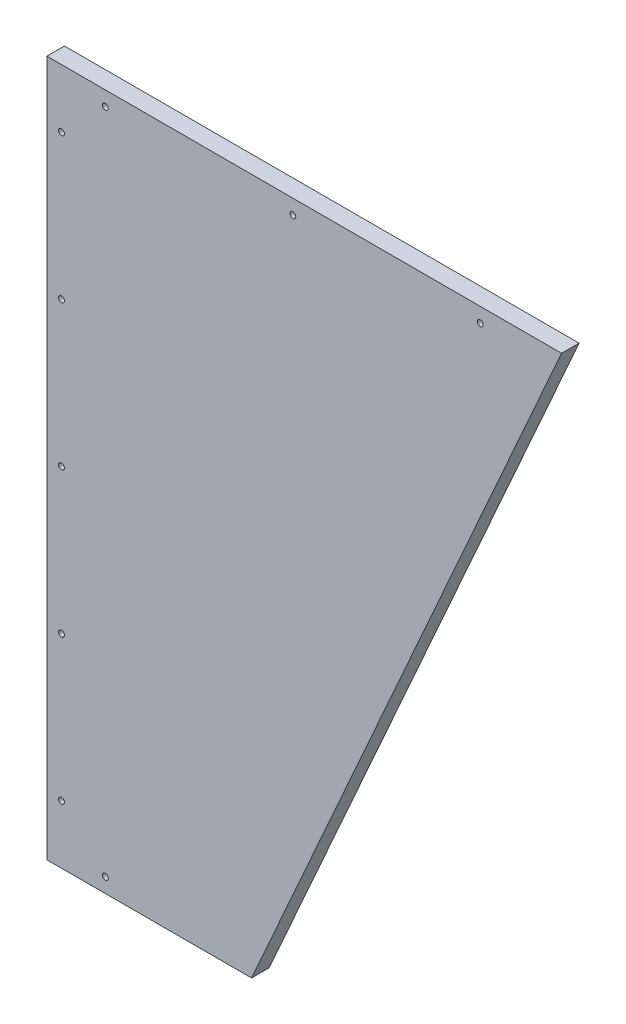
ISO-10303-21;
HEADER;
FILE_DESCRIPTION(('STEP AP214'),'2;1');
FILE_NAME('part.step','',(''),(''),'','','');
FILE_SCHEMA(('AUTOMOTIVE_DESIGN { 1 0 10303 214 1 1 1 1 }'));
ENDSEC;
DATA;
#1=APPLICATION_CONTEXT('core data for automotive mechanical design processes');
#2=APPLICATION_PROTOCOL_DEFINITION('international standard','automotive_design',2000,#1);
#3=PRODUCT_CONTEXT('',#1,'mechanical');
#4=PRODUCT('Part','Part','',(#3));
#5=PRODUCT_RELATED_PRODUCT_CATEGORY('part','',(#4));
#6=PRODUCT_DEFINITION_FORMATION('','',#4);
#7=PRODUCT_DEFINITION_CONTEXT('part definition',#1,'design');
#8=PRODUCT_DEFINITION('design','',#6,#7);
#9=PRODUCT_DEFINITION_SHAPE('','',#8);
#10=(LENGTH_UNIT() NAMED_UNIT(*) SI_UNIT(.MILLI.,.METRE.));
#11=(NAMED_UNIT(*) PLANE_ANGLE_UNIT() SI_UNIT($,.RADIAN.));
#12=(NAMED_UNIT(*) SI_UNIT($,.STERADIAN.) SOLID_ANGLE_UNIT());
#13=UNCERTAINTY_MEASURE_WITH_UNIT(LENGTH_MEASURE(1.E-05),#10,'distance_accuracy_value','');
#14=(GEOMETRIC_REPRESENTATION_CONTEXT(3) GLOBAL_UNCERTAINTY_ASSIGNED_CONTEXT((#13)) GLOBAL_UNIT_ASSIGNED_CONTEXT((#10,
#11,#12)) REPRESENTATION_CONTEXT('',''));
#15=CARTESIAN_POINT('',(0.,0.,0.));
#16=DIRECTION('',(0.,0.,1.));
#17=DIRECTION('',(1.,0.,0.));
#18=AXIS2_PLACEMENT_3D('',#15,#16,#17);
#19=CARTESIAN_POINT('',(220.,297.5,15.));
#20=DIRECTION('',(-0.913494717392276,0.406850588418409,0.));
#21=DIRECTION('',(-0.406850588418409,-0.913494717392276,0.));
#22=AXIS2_PLACEMENT_3D('',#19,#20,#21);
#23=PLANE('',#22);
#24=DIRECTION('',(0.406850588418409,0.913494717392276,0.));
#25=VECTOR('',#24,1.);
#26=CARTESIAN_POINT('',(220.,297.5,0.));
#27=LINE('',#26,#25);
#28=CARTESIAN_POINT('',(-44.9999999999999,-297.5,0.));
#29=VERTEX_POINT('',#28);
#30=CARTESIAN_POINT('',(220.,297.5,0.));
#31=VERTEX_POINT('',#30);
#32=EDGE_CURVE('E102',#29,#31,#27,.T.);
#33=ORIENTED_EDGE('',*,*,#32,.T.);
#34=DIRECTION('',(0.,0.,-1.));
#35=VECTOR('',#34,1.);
#36=CARTESIAN_POINT('',(220.,297.5,15.));
#37=LINE('',#36,#35);
#38=CARTESIAN_POINT('',(220.,297.5,15.));
#39=VERTEX_POINT('',#38);
#40=EDGE_CURVE('E11',#39,#31,#37,.T.);
#41=ORIENTED_EDGE('',*,*,#40,.F.);
#42=DIRECTION('',(0.406850588418409,0.913494717392276,0.));
#43=VECTOR('',#42,1.);
#44=CARTESIAN_POINT('',(220.,297.5,15.));
#45=LINE('',#44,#43);
#46=CARTESIAN_POINT('',(-44.9999999999999,-297.5,15.));
#47=VERTEX_POINT('',#46);
#48=EDGE_CURVE('E90',#47,#39,#45,.T.);
#49=ORIENTED_EDGE('',*,*,#48,.F.);
#50=DIRECTION('',(0.,0.,-1.));
#51=VECTOR('',#50,1.);
#52=CARTESIAN_POINT('',(-44.9999999999999,-297.5,15.));
#53=LINE('',#52,#51);
#54=EDGE_CURVE('E98',#47,#29,#53,.T.);
#55=ORIENTED_EDGE('',*,*,#54,.T.);
#56=EDGE_LOOP('',(#33,#41,#49,#55));
#57=FACE_BOUND('',#56,.T.);
#58=ADVANCED_FACE('F39',(#57),#23,.F.);
#59=CARTESIAN_POINT('',(-220.,297.5,15.));
#60=DIRECTION('',(0.,-1.,0.));
#61=DIRECTION('',(1.,0.,0.));
#62=AXIS2_PLACEMENT_3D('',#59,#60,#61);
#63=PLANE('',#62);
#64=DIRECTION('',(-1.,0.,0.));
#65=VECTOR('',#64,1.);
#66=CARTESIAN_POINT('',(-220.,297.5,0.));
#67=LINE('',#66,#65);
#68=CARTESIAN_POINT('',(-220.,297.5,0.));
#69=VERTEX_POINT('',#68);
#70=EDGE_CURVE('E94',#31,#69,#67,.T.);
#71=ORIENTED_EDGE('',*,*,#70,.T.);
#72=DIRECTION('',(0.,0.,-1.));
#73=VECTOR('',#72,1.);
#74=CARTESIAN_POINT('',(-220.,297.5,15.));
#75=LINE('',#74,#73);
#76=CARTESIAN_POINT('',(-220.,297.5,15.));
#77=VERTEX_POINT('',#76);
#78=EDGE_CURVE('E47',#77,#69,#75,.T.);
#79=ORIENTED_EDGE('',*,*,#78,.F.);
#80=DIRECTION('',(-1.,0.,0.));
#81=VECTOR('',#80,1.);
#82=CARTESIAN_POINT('',(-220.,297.5,15.));
#83=LINE('',#82,#81);
#84=EDGE_CURVE('E85',#39,#77,#83,.T.);
#85=ORIENTED_EDGE('',*,*,#84,.F.);
#86=ORIENTED_EDGE('',*,*,#40,.T.);
#87=EDGE_LOOP('',(#71,#79,#85,#86));
#88=FACE_BOUND('',#87,.T.);
#89=ADVANCED_FACE('F93',(#88),#63,.F.);
#90=CARTESIAN_POINT('',(-220.,297.5,15.));
#91=DIRECTION('',(1.,0.,0.));
#92=DIRECTION('',(0.,1.,0.));
#93=AXIS2_PLACEMENT_3D('',#90,#91,#92);
#94=PLANE('',#93);
#95=DIRECTION('',(0.,-1.,0.));
#96=VECTOR('',#95,1.);
#97=CARTESIAN_POINT('',(-220.,297.5,0.));
#98=LINE('',#97,#96);
#99=CARTESIAN_POINT('',(-220.,-297.5,0.));
#100=VERTEX_POINT('',#99);
#101=EDGE_CURVE('E72',#69,#100,#98,.T.);
#102=ORIENTED_EDGE('',*,*,#101,.T.);
#103=DIRECTION('',(0.,0.,-1.));
#104=VECTOR('',#103,1.);
#105=CARTESIAN_POINT('',(-220.,-297.5,15.));
#106=LINE('',#105,#104);
#107=CARTESIAN_POINT('',(-220.,-297.5,15.));
#108=VERTEX_POINT('',#107);
#109=EDGE_CURVE('E95',#108,#100,#106,.T.);
#110=ORIENTED_EDGE('',*,*,#109,.F.);
#111=DIRECTION('',(0.,-1.,0.));
#112=VECTOR('',#111,1.);
#113=CARTESIAN_POINT('',(-220.,297.5,15.));
#114=LINE('',#113,#112);
#115=EDGE_CURVE('E88',#77,#108,#114,.T.);
#116=ORIENTED_EDGE('',*,*,#115,.F.);
#117=ORIENTED_EDGE('',*,*,#78,.T.);
#118=EDGE_LOOP('',(#102,#110,#116,#117));
#119=FACE_BOUND('',#118,.T.);
#120=ADVANCED_FACE('F96',(#119),#94,.F.);
#121=CARTESIAN_POINT('',(-220.,-297.5,15.));
#122=DIRECTION('',(0.,1.,0.));
#123=DIRECTION('',(0.,0.,1.));
#124=AXIS2_PLACEMENT_3D('',#121,#122,#123);
#125=PLANE('',#124);
#126=DIRECTION('',(1.,0.,0.));
#127=VECTOR('',#126,1.);
#128=CARTESIAN_POINT('',(-220.,-297.5,0.));
#129=LINE('',#128,#127);
#130=EDGE_CURVE('E78',#100,#29,#129,.T.);
#131=ORIENTED_EDGE('',*,*,#130,.T.);
#132=ORIENTED_EDGE('',*,*,#54,.F.);
#133=DIRECTION('',(1.,0.,0.));
#134=VECTOR('',#133,1.);
#135=CARTESIAN_POINT('',(-220.,-297.5,15.));
#136=LINE('',#135,#134);
#137=EDGE_CURVE('E55',#108,#47,#136,.T.);
#138=ORIENTED_EDGE('',*,*,#137,.F.);
#139=ORIENTED_EDGE('',*,*,#109,.T.);
#140=EDGE_LOOP('',(#131,#132,#138,#139));
#141=FACE_BOUND('',#140,.T.);
#142=ADVANCED_FACE('F110',(#141),#125,.F.);
#143=CARTESIAN_POINT('',(0.,0.,15.));
#144=DIRECTION('',(0.,0.,1.));
#145=DIRECTION('',(1.,0.,0.));
#146=AXIS2_PLACEMENT_3D('',#143,#144,#145);
#147=PLANE('',#146);
#148=CARTESIAN_POINT('',(-170.,-285.,15.));
#149=DIRECTION('',(0.,0.,-1.));
#150=DIRECTION('',(1.,0.,0.));
#151=AXIS2_PLACEMENT_3D('',#148,#149,#150);
#152=CIRCLE('',#151,2.5);
#153=CARTESIAN_POINT('',(-167.5,-285.,15.));
#154=VERTEX_POINT('',#153);
#155=EDGE_CURVE('E164',#154,#154,#152,.T.);
#156=ORIENTED_EDGE('',*,*,#155,.T.);
#157=EDGE_LOOP('',(#156));
#158=FACE_BOUND('',#157,.T.);
#159=CARTESIAN_POINT('',(-207.5,247.5,15.));
#160=DIRECTION('',(0.,0.,1.));
#161=DIRECTION('',(1.,0.,0.));
#162=AXIS2_PLACEMENT_3D('',#159,#160,#161);
#163=CIRCLE('',#162,2.50000000000002);
#164=CARTESIAN_POINT('',(-205.,247.5,15.));
#165=VERTEX_POINT('',#164);
#166=EDGE_CURVE('E159',#165,#165,#163,.T.);
#167=ORIENTED_EDGE('',*,*,#166,.F.);
#168=EDGE_LOOP('',(#167));
#169=FACE_BOUND('',#168,.T.);
#170=CARTESIAN_POINT('',(-207.5,123.75,15.));
#171=DIRECTION('',(0.,0.,1.));
#172=DIRECTION('',(1.,0.,0.));
#173=AXIS2_PLACEMENT_3D('',#170,#171,#172);
#174=CIRCLE('',#173,2.50000000000002);
#175=CARTESIAN_POINT('',(-205.,123.75,15.));
#176=VERTEX_POINT('',#175);
#177=EDGE_CURVE('E156',#176,#176,#174,.T.);
#178=ORIENTED_EDGE('',*,*,#177,.F.);
#179=EDGE_LOOP('',(#178));
#180=FACE_BOUND('',#179,.T.);
#181=CARTESIAN_POINT('',(-207.5,0.,15.));
#182=DIRECTION('',(0.,0.,1.));
#183=DIRECTION('',(1.,0.,0.));
#184=AXIS2_PLACEMENT_3D('',#181,#182,#183);
#185=CIRCLE('',#184,2.50000000000002);
#186=CARTESIAN_POINT('',(-205.,0.,15.));
#187=VERTEX_POINT('',#186);
#188=EDGE_CURVE('E150',#187,#187,#185,.T.);
#189=ORIENTED_EDGE('',*,*,#188,.F.);
#190=EDGE_LOOP('',(#189));
#191=FACE_BOUND('',#190,.T.);
#192=CARTESIAN_POINT('',(-207.5,-123.75,15.));
#193=DIRECTION('',(0.,0.,1.));
#194=DIRECTION('',(1.,0.,0.));
#195=AXIS2_PLACEMENT_3D('',#192,#193,#194);
#196=CIRCLE('',#195,2.50000000000002);
#197=CARTESIAN_POINT('',(-205.,-123.75,15.));
#198=VERTEX_POINT('',#197);
#199=EDGE_CURVE('E144',#198,#198,#196,.T.);
#200=ORIENTED_EDGE('',*,*,#199,.F.);
#201=EDGE_LOOP('',(#200));
#202=FACE_BOUND('',#201,.T.);
#203=CARTESIAN_POINT('',(-207.5,-247.5,15.));
#204=DIRECTION('',(0.,0.,1.));
#205=DIRECTION('',(1.,0.,0.));
#206=AXIS2_PLACEMENT_3D('',#203,#204,#205);
#207=CIRCLE('',#206,2.50000000000002);
#208=CARTESIAN_POINT('',(-205.,-247.5,15.));
#209=VERTEX_POINT('',#208);
#210=EDGE_CURVE('E137',#209,#209,#207,.T.);
#211=ORIENTED_EDGE('',*,*,#210,.F.);
#212=EDGE_LOOP('',(#211));
#213=FACE_BOUND('',#212,.T.);
#214=CARTESIAN_POINT('',(-170.,285.,15.));
#215=DIRECTION('',(0.,0.,1.));
#216=DIRECTION('',(1.,0.,0.));
#217=AXIS2_PLACEMENT_3D('',#214,#215,#216);
#218=CIRCLE('',#217,2.5);
#219=CARTESIAN_POINT('',(-167.5,285.,15.));
#220=VERTEX_POINT('',#219);
#221=EDGE_CURVE('E129',#220,#220,#218,.T.);
#222=ORIENTED_EDGE('',*,*,#221,.F.);
#223=EDGE_LOOP('',(#222));
#224=FACE_BOUND('',#223,.T.);
#225=CARTESIAN_POINT('',(-9.72499999999993,285.,15.));
#226=DIRECTION('',(0.,0.,1.));
#227=DIRECTION('',(1.,0.,0.));
#228=AXIS2_PLACEMENT_3D('',#225,#226,#227);
#229=CIRCLE('',#228,2.5);
#230=CARTESIAN_POINT('',(-7.22499999999993,285.,15.));
#231=VERTEX_POINT('',#230);
#232=EDGE_CURVE('E126',#231,#231,#229,.T.);
#233=ORIENTED_EDGE('',*,*,#232,.F.);
#234=EDGE_LOOP('',(#233));
#235=FACE_BOUND('',#234,.T.);
#236=CARTESIAN_POINT('',(150.55,285.,15.));
#237=DIRECTION('',(0.,0.,1.));
#238=DIRECTION('',(1.,0.,0.));
#239=AXIS2_PLACEMENT_3D('',#236,#237,#238);
#240=CIRCLE('',#239,2.49999999999985);
#241=CARTESIAN_POINT('',(153.05,285.,15.));
#242=VERTEX_POINT('',#241);
#243=EDGE_CURVE('E119',#242,#242,#240,.T.);
#244=ORIENTED_EDGE('',*,*,#243,.F.);
#245=EDGE_LOOP('',(#244));
#246=FACE_BOUND('',#245,.T.);
#247=ORIENTED_EDGE('',*,*,#48,.T.);
#248=ORIENTED_EDGE('',*,*,#84,.T.);
#249=ORIENTED_EDGE('',*,*,#115,.T.);
#250=ORIENTED_EDGE('',*,*,#137,.T.);
#251=EDGE_LOOP('',(#247,#248,#249,#250));
#252=FACE_BOUND('',#251,.T.);
#253=ADVANCED_FACE('F86',(#158,#169,#180,#191,#202,#213,#224,#235,#246,#252),#147,.T.);
#254=CARTESIAN_POINT('',(0.,0.,0.));
#255=DIRECTION('',(0.,0.,1.));
#256=DIRECTION('',(1.,0.,0.));
#257=AXIS2_PLACEMENT_3D('',#254,#255,#256);
#258=PLANE('',#257);
#259=CARTESIAN_POINT('',(-170.,-285.,0.));
#260=DIRECTION('',(0.,0.,-1.));
#261=DIRECTION('',(1.,0.,0.));
#262=AXIS2_PLACEMENT_3D('',#259,#260,#261);
#263=CIRCLE('',#262,2.5);
#264=CARTESIAN_POINT('',(-167.5,-285.,0.));
#265=VERTEX_POINT('',#264);
#266=EDGE_CURVE('E138',#265,#265,#263,.T.);
#267=ORIENTED_EDGE('',*,*,#266,.F.);
#268=EDGE_LOOP('',(#267));
#269=FACE_BOUND('',#268,.T.);
#270=CARTESIAN_POINT('',(-207.5,247.5,0.));
#271=DIRECTION('',(0.,0.,1.));
#272=DIRECTION('',(1.,0.,0.));
#273=AXIS2_PLACEMENT_3D('',#270,#271,#272);
#274=CIRCLE('',#273,2.50000000000002);
#275=CARTESIAN_POINT('',(-205.,247.5,0.));
#276=VERTEX_POINT('',#275);
#277=EDGE_CURVE('E120',#276,#276,#274,.T.);
#278=ORIENTED_EDGE('',*,*,#277,.T.);
#279=EDGE_LOOP('',(#278));
#280=FACE_BOUND('',#279,.T.);
#281=CARTESIAN_POINT('',(-207.5,123.75,0.));
#282=DIRECTION('',(0.,0.,1.));
#283=DIRECTION('',(1.,0.,0.));
#284=AXIS2_PLACEMENT_3D('',#281,#282,#283);
#285=CIRCLE('',#284,2.50000000000002);
#286=CARTESIAN_POINT('',(-205.,123.75,0.));
#287=VERTEX_POINT('',#286);
#288=EDGE_CURVE('E153',#287,#287,#285,.T.);
#289=ORIENTED_EDGE('',*,*,#288,.T.);
#290=EDGE_LOOP('',(#289));
#291=FACE_BOUND('',#290,.T.);
#292=CARTESIAN_POINT('',(-207.5,0.,0.));
#293=DIRECTION('',(0.,0.,1.));
#294=DIRECTION('',(1.,0.,0.));
#295=AXIS2_PLACEMENT_3D('',#292,#293,#294);
#296=CIRCLE('',#295,2.50000000000002);
#297=CARTESIAN_POINT('',(-205.,0.,0.));
#298=VERTEX_POINT('',#297);
#299=EDGE_CURVE('E147',#298,#298,#296,.T.);
#300=ORIENTED_EDGE('',*,*,#299,.T.);
#301=EDGE_LOOP('',(#300));
#302=FACE_BOUND('',#301,.T.);
#303=CARTESIAN_POINT('',(-207.5,-123.75,0.));
#304=DIRECTION('',(0.,0.,1.));
#305=DIRECTION('',(1.,0.,0.));
#306=AXIS2_PLACEMENT_3D('',#303,#304,#305);
#307=CIRCLE('',#306,2.50000000000002);
#308=CARTESIAN_POINT('',(-205.,-123.75,0.));
#309=VERTEX_POINT('',#308);
#310=EDGE_CURVE('E141',#309,#309,#307,.T.);
#311=ORIENTED_EDGE('',*,*,#310,.T.);
#312=EDGE_LOOP('',(#311));
#313=FACE_BOUND('',#312,.T.);
#314=CARTESIAN_POINT('',(-207.5,-247.5,0.));
#315=DIRECTION('',(0.,0.,1.));
#316=DIRECTION('',(1.,0.,0.));
#317=AXIS2_PLACEMENT_3D('',#314,#315,#316);
#318=CIRCLE('',#317,2.50000000000002);
#319=CARTESIAN_POINT('',(-205.,-247.5,0.));
#320=VERTEX_POINT('',#319);
#321=EDGE_CURVE('E134',#320,#320,#318,.T.);
#322=ORIENTED_EDGE('',*,*,#321,.T.);
#323=EDGE_LOOP('',(#322));
#324=FACE_BOUND('',#323,.T.);
#325=CARTESIAN_POINT('',(-170.,285.,0.));
#326=DIRECTION('',(0.,0.,1.));
#327=DIRECTION('',(1.,0.,0.));
#328=AXIS2_PLACEMENT_3D('',#325,#326,#327);
#329=CIRCLE('',#328,2.5);
#330=CARTESIAN_POINT('',(-167.5,285.,0.));
#331=VERTEX_POINT('',#330);
#332=EDGE_CURVE('E105',#331,#331,#329,.T.);
#333=ORIENTED_EDGE('',*,*,#332,.T.);
#334=EDGE_LOOP('',(#333));
#335=FACE_BOUND('',#334,.T.);
#336=CARTESIAN_POINT('',(-9.72499999999993,285.,0.));
#337=DIRECTION('',(0.,0.,1.));
#338=DIRECTION('',(1.,0.,0.));
#339=AXIS2_PLACEMENT_3D('',#336,#337,#338);
#340=CIRCLE('',#339,2.5);
#341=CARTESIAN_POINT('',(-7.22499999999993,285.,0.));
#342=VERTEX_POINT('',#341);
#343=EDGE_CURVE('E123',#342,#342,#340,.T.);
#344=ORIENTED_EDGE('',*,*,#343,.T.);
#345=EDGE_LOOP('',(#344));
#346=FACE_BOUND('',#345,.T.);
#347=CARTESIAN_POINT('',(150.55,285.,0.));
#348=DIRECTION('',(0.,0.,1.));
#349=DIRECTION('',(1.,0.,0.));
#350=AXIS2_PLACEMENT_3D('',#347,#348,#349);
#351=CIRCLE('',#350,2.49999999999985);
#352=CARTESIAN_POINT('',(153.05,285.,0.));
#353=VERTEX_POINT('',#352);
#354=EDGE_CURVE('E116',#353,#353,#351,.T.);
#355=ORIENTED_EDGE('',*,*,#354,.T.);
#356=EDGE_LOOP('',(#355));
#357=FACE_BOUND('',#356,.T.);
#358=ORIENTED_EDGE('',*,*,#32,.F.);
#359=ORIENTED_EDGE('',*,*,#130,.F.);
#360=ORIENTED_EDGE('',*,*,#101,.F.);
#361=ORIENTED_EDGE('',*,*,#70,.F.);
#362=EDGE_LOOP('',(#358,#359,#360,#361));
#363=FACE_BOUND('',#362,.T.);
#364=ADVANCED_FACE('F113',(#269,#280,#291,#302,#313,#324,#335,#346,#357,#363),#258,.F.);
#365=CARTESIAN_POINT('',(150.55,285.,0.));
#366=DIRECTION('',(0.,0.,1.));
#367=DIRECTION('',(1.,0.,0.));
#368=AXIS2_PLACEMENT_3D('',#365,#366,#367);
#369=CYLINDRICAL_SURFACE('',#368,2.49999999999985);
#370=ORIENTED_EDGE('',*,*,#354,.F.);
#371=EDGE_LOOP('',(#370));
#372=FACE_BOUND('',#371,.T.);
#373=ORIENTED_EDGE('',*,*,#243,.T.);
#374=EDGE_LOOP('',(#373));
#375=FACE_BOUND('',#374,.T.);
#376=ADVANCED_FACE('F175',(#372,#375),#369,.F.);
#377=CARTESIAN_POINT('',(-9.72499999999993,285.,0.));
#378=DIRECTION('',(0.,0.,1.));
#379=DIRECTION('',(1.,0.,0.));
#380=AXIS2_PLACEMENT_3D('',#377,#378,#379);
#381=CYLINDRICAL_SURFACE('',#380,2.5);
#382=ORIENTED_EDGE('',*,*,#343,.F.);
#383=EDGE_LOOP('',(#382));
#384=FACE_BOUND('',#383,.T.);
#385=ORIENTED_EDGE('',*,*,#232,.T.);
#386=EDGE_LOOP('',(#385));
#387=FACE_BOUND('',#386,.T.);
#388=ADVANCED_FACE('F195',(#384,#387),#381,.F.);
#389=CARTESIAN_POINT('',(-170.,285.,0.));
#390=DIRECTION('',(0.,0.,1.));
#391=DIRECTION('',(1.,0.,0.));
#392=AXIS2_PLACEMENT_3D('',#389,#390,#391);
#393=CYLINDRICAL_SURFACE('',#392,2.5);
#394=ORIENTED_EDGE('',*,*,#332,.F.);
#395=EDGE_LOOP('',(#394));
#396=FACE_BOUND('',#395,.T.);
#397=ORIENTED_EDGE('',*,*,#221,.T.);
#398=EDGE_LOOP('',(#397));
#399=FACE_BOUND('',#398,.T.);
#400=ADVANCED_FACE('F240',(#396,#399),#393,.F.);
#401=CARTESIAN_POINT('',(-207.5,-247.5,0.));
#402=DIRECTION('',(0.,0.,1.));
#403=DIRECTION('',(1.,0.,0.));
#404=AXIS2_PLACEMENT_3D('',#401,#402,#403);
#405=CYLINDRICAL_SURFACE('',#404,2.50000000000002);
#406=ORIENTED_EDGE('',*,*,#321,.F.);
#407=EDGE_LOOP('',(#406));
#408=FACE_BOUND('',#407,.T.);
#409=ORIENTED_EDGE('',*,*,#210,.T.);
#410=EDGE_LOOP('',(#409));
#411=FACE_BOUND('',#410,.T.);
#412=ADVANCED_FACE('F251',(#408,#411),#405,.F.);
#413=CARTESIAN_POINT('',(-207.5,-123.75,0.));
#414=DIRECTION('',(0.,0.,1.));
#415=DIRECTION('',(1.,0.,0.));
#416=AXIS2_PLACEMENT_3D('',#413,#414,#415);
#417=CYLINDRICAL_SURFACE('',#416,2.50000000000002);
#418=ORIENTED_EDGE('',*,*,#310,.F.);
#419=EDGE_LOOP('',(#418));
#420=FACE_BOUND('',#419,.T.);
#421=ORIENTED_EDGE('',*,*,#199,.T.);
#422=EDGE_LOOP('',(#421));
#423=FACE_BOUND('',#422,.T.);
#424=ADVANCED_FACE('F262',(#420,#423),#417,.F.);
#425=CARTESIAN_POINT('',(-207.5,0.,0.));
#426=DIRECTION('',(0.,0.,1.));
#427=DIRECTION('',(1.,0.,0.));
#428=AXIS2_PLACEMENT_3D('',#425,#426,#427);
#429=CYLINDRICAL_SURFACE('',#428,2.50000000000002);
#430=ORIENTED_EDGE('',*,*,#299,.F.);
#431=EDGE_LOOP('',(#430));
#432=FACE_BOUND('',#431,.T.);
#433=ORIENTED_EDGE('',*,*,#188,.T.);
#434=EDGE_LOOP('',(#433));
#435=FACE_BOUND('',#434,.T.);
#436=ADVANCED_FACE('F273',(#432,#435),#429,.F.);
#437=CARTESIAN_POINT('',(-207.5,123.75,0.));
#438=DIRECTION('',(0.,0.,1.));
#439=DIRECTION('',(1.,0.,0.));
#440=AXIS2_PLACEMENT_3D('',#437,#438,#439);
#441=CYLINDRICAL_SURFACE('',#440,2.50000000000002);
#442=ORIENTED_EDGE('',*,*,#288,.F.);
#443=EDGE_LOOP('',(#442));
#444=FACE_BOUND('',#443,.T.);
#445=ORIENTED_EDGE('',*,*,#177,.T.);
#446=EDGE_LOOP('',(#445));
#447=FACE_BOUND('',#446,.T.);
#448=ADVANCED_FACE('F284',(#444,#447),#441,.F.);
#449=CARTESIAN_POINT('',(-207.5,247.5,0.));
#450=DIRECTION('',(0.,0.,1.));
#451=DIRECTION('',(1.,0.,0.));
#452=AXIS2_PLACEMENT_3D('',#449,#450,#451);
#453=CYLINDRICAL_SURFACE('',#452,2.50000000000002);
#454=ORIENTED_EDGE('',*,*,#277,.F.);
#455=EDGE_LOOP('',(#454));
#456=FACE_BOUND('',#455,.T.);
#457=ORIENTED_EDGE('',*,*,#166,.T.);
#458=EDGE_LOOP('',(#457));
#459=FACE_BOUND('',#458,.T.);
#460=ADVANCED_FACE('F295',(#456,#459),#453,.F.);
#461=CARTESIAN_POINT('',(-170.,-285.,0.));
#462=DIRECTION('',(0.,0.,1.));
#463=DIRECTION('',(1.,0.,0.));
#464=AXIS2_PLACEMENT_3D('',#461,#462,#463);
#465=CYLINDRICAL_SURFACE('',#464,2.5);
#466=ORIENTED_EDGE('',*,*,#266,.T.);
#467=EDGE_LOOP('',(#466));
#468=FACE_BOUND('',#467,.T.);
#469=ORIENTED_EDGE('',*,*,#155,.F.);
#470=EDGE_LOOP('',(#469));
#471=FACE_BOUND('',#470,.T.);
#472=ADVANCED_FACE('F170',(#468,#471),#465,.F.);
#473=CLOSED_SHELL('',(#58,#89,#120,#142,#253,#364,#376,#388,#400,#412,#424,#436,#448,#460,#472));
#474=MANIFOLD_SOLID_BREP('B2',#473);
#475=ADVANCED_BREP_SHAPE_REPRESENTATION('',(#18,#474),#14);
#476=SHAPE_DEFINITION_REPRESENTATION(#9,#475);
ENDSEC;
END-ISO-10303-21;
